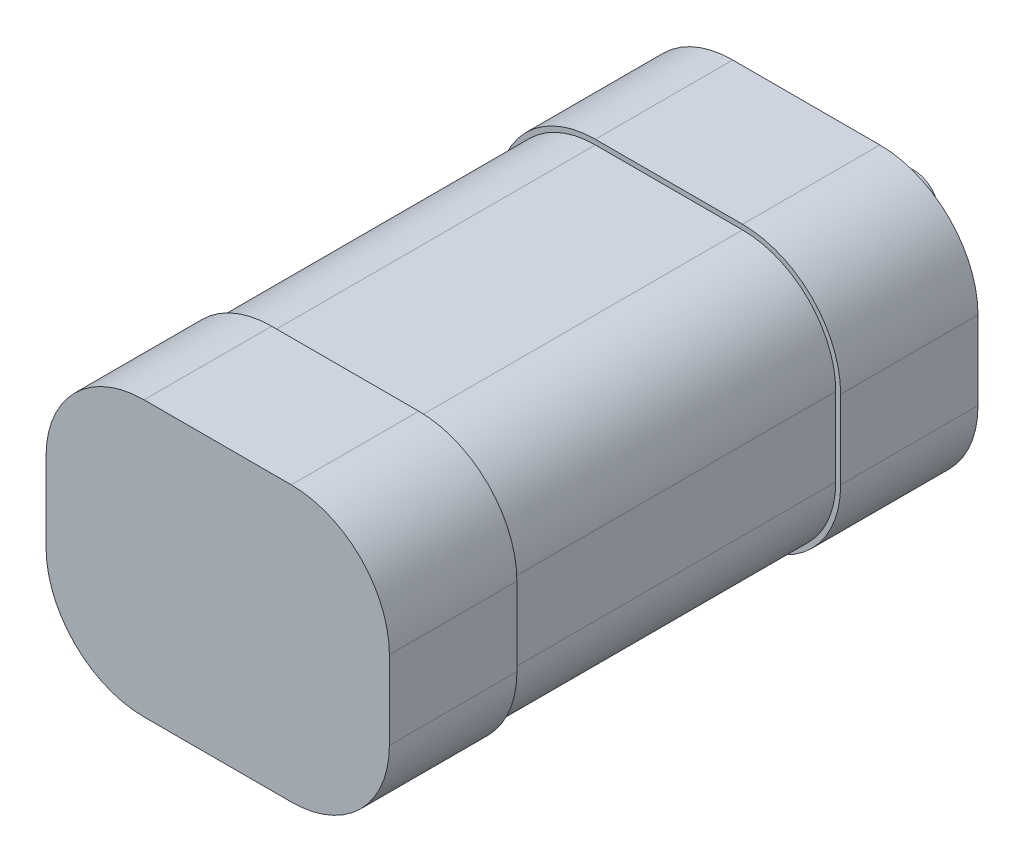
ISO-10303-21;
HEADER;
FILE_DESCRIPTION(('STEP AP214'),'2;1');
FILE_NAME('part.step','',(''),(''),'','','');
FILE_SCHEMA(('AUTOMOTIVE_DESIGN { 1 0 10303 214 1 1 1 1 }'));
ENDSEC;
DATA;
#1=APPLICATION_CONTEXT('core data for automotive mechanical design processes');
#2=APPLICATION_PROTOCOL_DEFINITION('international standard','automotive_design',2000,#1);
#3=PRODUCT_CONTEXT('',#1,'mechanical');
#4=PRODUCT('Part','Part','',(#3));
#5=PRODUCT_RELATED_PRODUCT_CATEGORY('part','',(#4));
#6=PRODUCT_DEFINITION_FORMATION('','',#4);
#7=PRODUCT_DEFINITION_CONTEXT('part definition',#1,'design');
#8=PRODUCT_DEFINITION('design','',#6,#7);
#9=PRODUCT_DEFINITION_SHAPE('','',#8);
#10=(LENGTH_UNIT() NAMED_UNIT(*) SI_UNIT(.MILLI.,.METRE.));
#11=(NAMED_UNIT(*) PLANE_ANGLE_UNIT() SI_UNIT($,.RADIAN.));
#12=(NAMED_UNIT(*) SI_UNIT($,.STERADIAN.) SOLID_ANGLE_UNIT());
#13=UNCERTAINTY_MEASURE_WITH_UNIT(LENGTH_MEASURE(1.E-05),#10,'distance_accuracy_value','');
#14=(GEOMETRIC_REPRESENTATION_CONTEXT(3) GLOBAL_UNCERTAINTY_ASSIGNED_CONTEXT((#13)) GLOBAL_UNIT_ASSIGNED_CONTEXT((#10,
#11,#12)) REPRESENTATION_CONTEXT('',''));
#15=CARTESIAN_POINT('',(0.,0.,0.));
#16=DIRECTION('',(0.,0.,1.));
#17=DIRECTION('',(1.,0.,0.));
#18=AXIS2_PLACEMENT_3D('',#15,#16,#17);
#19=CARTESIAN_POINT('',(-1.75,-1.4,-7.1));
#20=DIRECTION('',(0.,0.,1.));
#21=DIRECTION('',(1.,0.,0.));
#22=AXIS2_PLACEMENT_3D('',#19,#20,#21);
#23=PLANE('',#22);
#24=CARTESIAN_POINT('',(0.,0.,-7.1));
#25=DIRECTION('',(0.,0.,1.));
#26=DIRECTION('',(1.,0.,0.));
#27=AXIS2_PLACEMENT_3D('',#24,#25,#26);
#28=CIRCLE('',#27,0.25);
#29=CARTESIAN_POINT('',(0.25,0.,-7.1));
#30=VERTEX_POINT('',#29);
#31=EDGE_CURVE('E18',#30,#30,#28,.T.);
#32=ORIENTED_EDGE('',*,*,#31,.F.);
#33=EDGE_LOOP('',(#32));
#34=FACE_BOUND('',#33,.T.);
#35=ADVANCED_FACE('F15',(#34),#23,.F.);
#36=CARTESIAN_POINT('',(0.,0.,-14.9071067811865));
#37=DIRECTION('',(0.,0.,1.));
#38=DIRECTION('',(1.,0.,0.));
#39=AXIS2_PLACEMENT_3D('',#36,#37,#38);
#40=CYLINDRICAL_SURFACE('',#39,0.25);
#41=CARTESIAN_POINT('',(0.,0.,-6.5));
#42=DIRECTION('',(0.,0.,1.));
#43=DIRECTION('',(1.,0.,0.));
#44=AXIS2_PLACEMENT_3D('',#41,#42,#43);
#45=CIRCLE('',#44,0.25);
#46=CARTESIAN_POINT('',(0.25,0.,-6.5));
#47=VERTEX_POINT('',#46);
#48=EDGE_CURVE('E189',#47,#47,#45,.T.);
#49=ORIENTED_EDGE('',*,*,#48,.F.);
#50=EDGE_LOOP('',(#49));
#51=FACE_BOUND('',#50,.T.);
#52=ORIENTED_EDGE('',*,*,#31,.T.);
#53=EDGE_LOOP('',(#52));
#54=FACE_BOUND('',#53,.T.);
#55=ADVANCED_FACE('F380',(#51,#54),#40,.T.);
#56=CARTESIAN_POINT('',(-0.75,-0.4,-6.5));
#57=DIRECTION('',(0.,0.,-1.));
#58=DIRECTION('',(-1.,0.,0.));
#59=AXIS2_PLACEMENT_3D('',#56,#57,#58);
#60=PLANE('',#59);
#61=ORIENTED_EDGE('',*,*,#48,.T.);
#62=EDGE_LOOP('',(#61));
#63=FACE_BOUND('',#62,.T.);
#64=CARTESIAN_POINT('',(0.75,-0.4,-6.49999999997521));
#65=DIRECTION('',(0.,0.,1.));
#66=DIRECTION('',(0.,-1.,0.));
#67=AXIS2_PLACEMENT_3D('',#64,#65,#66);
#68=CIRCLE('',#67,0.133974596184998);
#69=CARTESIAN_POINT('',(0.75,-0.533974596237022,-6.49999999998761));
#70=VERTEX_POINT('',#69);
#71=CARTESIAN_POINT('',(0.883974596174903,-0.4,-6.50000000000602));
#72=VERTEX_POINT('',#71);
#73=EDGE_CURVE('E243',#70,#72,#68,.T.);
#74=ORIENTED_EDGE('',*,*,#73,.F.);
#75=DIRECTION('',(1.,0.,0.));
#76=VECTOR('',#75,1.);
#77=CARTESIAN_POINT('',(0.75,-0.533974596215556,-6.5));
#78=LINE('',#77,#76);
#79=CARTESIAN_POINT('',(-0.75,-0.533974596192591,-6.49999999999181));
#80=VERTEX_POINT('',#79);
#81=EDGE_CURVE('E187',#80,#70,#78,.T.);
#82=ORIENTED_EDGE('',*,*,#81,.F.);
#83=CARTESIAN_POINT('',(-0.75,-0.4,-6.49999999997521));
#84=DIRECTION('',(0.,0.,1.));
#85=DIRECTION('',(0.,-1.,0.));
#86=AXIS2_PLACEMENT_3D('',#83,#84,#85);
#87=CIRCLE('',#86,0.133974596206372);
#88=CARTESIAN_POINT('',(-0.883974596174903,-0.4,-6.50000000000602));
#89=VERTEX_POINT('',#88);
#90=EDGE_CURVE('E179',#80,#89,#87,.F.);
#91=ORIENTED_EDGE('',*,*,#90,.T.);
#92=DIRECTION('',(0.,1.,0.));
#93=VECTOR('',#92,1.);
#94=CARTESIAN_POINT('',(-0.883974596215556,-0.4,-6.5));
#95=LINE('',#94,#93);
#96=CARTESIAN_POINT('',(-0.883974596174903,0.4,-6.50000000000602));
#97=VERTEX_POINT('',#96);
#98=EDGE_CURVE('E184',#97,#89,#95,.F.);
#99=ORIENTED_EDGE('',*,*,#98,.F.);
#100=CARTESIAN_POINT('',(-0.75,0.4,-6.49999999997521));
#101=DIRECTION('',(0.,0.,1.));
#102=DIRECTION('',(0.,-1.,0.));
#103=AXIS2_PLACEMENT_3D('',#100,#101,#102);
#104=CIRCLE('',#103,0.133974596206372);
#105=CARTESIAN_POINT('',(-0.75,0.533974596237022,-6.49999999998761));
#106=VERTEX_POINT('',#105);
#107=EDGE_CURVE('E200',#106,#97,#104,.T.);
#108=ORIENTED_EDGE('',*,*,#107,.F.);
#109=DIRECTION('',(1.,0.,0.));
#110=VECTOR('',#109,1.);
#111=CARTESIAN_POINT('',(-0.75,0.533974596215555,-6.5));
#112=LINE('',#111,#110);
#113=CARTESIAN_POINT('',(0.75,0.533974596164169,-6.50000000000602));
#114=VERTEX_POINT('',#113);
#115=EDGE_CURVE('E273',#114,#106,#112,.F.);
#116=ORIENTED_EDGE('',*,*,#115,.F.);
#117=CARTESIAN_POINT('',(0.75,0.4,-6.49999999997521));
#118=DIRECTION('',(0.,0.,1.));
#119=DIRECTION('',(0.,-1.,0.));
#120=AXIS2_PLACEMENT_3D('',#117,#118,#119);
#121=CIRCLE('',#120,0.133974596184998);
#122=CARTESIAN_POINT('',(0.883974596237022,0.4,-6.49999999998761));
#123=VERTEX_POINT('',#122);
#124=EDGE_CURVE('E267',#123,#114,#121,.T.);
#125=ORIENTED_EDGE('',*,*,#124,.F.);
#126=DIRECTION('',(0.,1.,0.));
#127=VECTOR('',#126,1.);
#128=CARTESIAN_POINT('',(0.883974596215556,0.4,-6.5));
#129=LINE('',#128,#127);
#130=EDGE_CURVE('E249',#72,#123,#129,.T.);
#131=ORIENTED_EDGE('',*,*,#130,.F.);
#132=EDGE_LOOP('',(#74,#82,#91,#99,#108,#116,#125,#131));
#133=FACE_BOUND('',#132,.T.);
#134=ADVANCED_FACE('F183',(#63,#133),#60,.T.);
#135=CARTESIAN_POINT('',(0.75,-1.35,-13.5416586692185));
#136=DIRECTION('',(0.,1.,0.));
#137=DIRECTION('',(-1.,0.,0.));
#138=AXIS2_PLACEMENT_3D('',#135,#136,#137);
#139=PLANE('',#138);
#140=DIRECTION('',(-1.,0.,0.));
#141=VECTOR('',#140,1.);
#142=CARTESIAN_POINT('',(0.75,-1.35,-4.6));
#143=LINE('',#142,#141);
#144=CARTESIAN_POINT('',(0.75,-1.35,-4.6));
#145=VERTEX_POINT('',#144);
#146=CARTESIAN_POINT('',(-0.75,-1.35,-4.6));
#147=VERTEX_POINT('',#146);
#148=EDGE_CURVE('E293',#145,#147,#143,.T.);
#149=ORIENTED_EDGE('',*,*,#148,.F.);
#150=DIRECTION('',(0.,0.,1.));
#151=VECTOR('',#150,1.);
#152=CARTESIAN_POINT('',(0.75,-1.35,-13.5416586692185));
#153=LINE('',#152,#151);
#154=CARTESIAN_POINT('',(0.75,-1.35,-1.3));
#155=VERTEX_POINT('',#154);
#156=EDGE_CURVE('E211',#155,#145,#153,.F.);
#157=ORIENTED_EDGE('',*,*,#156,.F.);
#158=DIRECTION('',(-1.,0.,0.));
#159=VECTOR('',#158,1.);
#160=CARTESIAN_POINT('',(0.75,-1.35,-1.3));
#161=LINE('',#160,#159);
#162=CARTESIAN_POINT('',(-0.75,-1.35,-1.3));
#163=VERTEX_POINT('',#162);
#164=EDGE_CURVE('E291',#163,#155,#161,.F.);
#165=ORIENTED_EDGE('',*,*,#164,.F.);
#166=DIRECTION('',(0.,0.,1.));
#167=VECTOR('',#166,1.);
#168=CARTESIAN_POINT('',(-0.75,-1.35,-13.5416586692185));
#169=LINE('',#168,#167);
#170=EDGE_CURVE('E301',#147,#163,#169,.T.);
#171=ORIENTED_EDGE('',*,*,#170,.F.);
#172=EDGE_LOOP('',(#149,#157,#165,#171));
#173=FACE_BOUND('',#172,.T.);
#174=ADVANCED_FACE('F524',(#173),#139,.F.);
#175=CARTESIAN_POINT('',(-0.75,-0.4,-13.5416586692185));
#176=DIRECTION('',(0.,0.,1.));
#177=DIRECTION('',(1.,0.,0.));
#178=AXIS2_PLACEMENT_3D('',#175,#176,#177);
#179=CYLINDRICAL_SURFACE('',#178,0.95);
#180=ORIENTED_EDGE('',*,*,#170,.T.);
#181=CARTESIAN_POINT('',(-0.75,-0.4,-1.3));
#182=DIRECTION('',(0.,0.,1.));
#183=DIRECTION('',(1.,0.,0.));
#184=AXIS2_PLACEMENT_3D('',#181,#182,#183);
#185=CIRCLE('',#184,0.95);
#186=CARTESIAN_POINT('',(-1.7,-0.4,-1.3));
#187=VERTEX_POINT('',#186);
#188=EDGE_CURVE('E201',#163,#187,#185,.F.);
#189=ORIENTED_EDGE('',*,*,#188,.T.);
#190=DIRECTION('',(0.,0.,1.));
#191=VECTOR('',#190,1.);
#192=CARTESIAN_POINT('',(-1.7,-0.4,-13.5416586692185));
#193=LINE('',#192,#191);
#194=CARTESIAN_POINT('',(-1.7,-0.4,-4.6));
#195=VERTEX_POINT('',#194);
#196=EDGE_CURVE('E284',#187,#195,#193,.F.);
#197=ORIENTED_EDGE('',*,*,#196,.T.);
#198=CARTESIAN_POINT('',(-0.75,-0.4,-4.6));
#199=DIRECTION('',(0.,0.,1.));
#200=DIRECTION('',(1.,0.,0.));
#201=AXIS2_PLACEMENT_3D('',#198,#199,#200);
#202=CIRCLE('',#201,0.95);
#203=EDGE_CURVE('E295',#195,#147,#202,.T.);
#204=ORIENTED_EDGE('',*,*,#203,.T.);
#205=EDGE_LOOP('',(#180,#189,#197,#204));
#206=FACE_BOUND('',#205,.T.);
#207=ADVANCED_FACE('F521',(#206),#179,.T.);
#208=CARTESIAN_POINT('',(-1.75,-0.4,-6.));
#209=DIRECTION('',(-0.499999999999998,0.,-0.86602540378444));
#210=DIRECTION('',(-0.86602540378444,0.,0.499999999999998));
#211=AXIS2_PLACEMENT_3D('',#208,#209,#210);
#212=PLANE('',#211);
#213=ORIENTED_EDGE('',*,*,#98,.T.);
#214=DIRECTION('',(0.86602540378444,0.,-0.499999999999998));
#215=VECTOR('',#214,1.);
#216=CARTESIAN_POINT('',(-499000.,-0.4,288090.773962651));
#217=LINE('',#216,#215);
#218=CARTESIAN_POINT('',(-1.74999999994702,-0.4,-6.00000000002137));
#219=VERTEX_POINT('',#218);
#220=EDGE_CURVE('E195',#219,#89,#217,.T.);
#221=ORIENTED_EDGE('',*,*,#220,.F.);
#222=DIRECTION('',(0.,1.,0.));
#223=VECTOR('',#222,1.);
#224=CARTESIAN_POINT('',(-1.75,-0.4,-6.));
#225=LINE('',#224,#223);
#226=CARTESIAN_POINT('',(-1.74999999994702,0.4,-6.00000000002137));
#227=VERTEX_POINT('',#226);
#228=EDGE_CURVE('E220',#219,#227,#225,.T.);
#229=ORIENTED_EDGE('',*,*,#228,.T.);
#230=DIRECTION('',(0.86602540378444,0.,-0.499999999999998));
#231=VECTOR('',#230,1.);
#232=CARTESIAN_POINT('',(-499000.,0.4,288090.773962651));
#233=LINE('',#232,#231);
#234=EDGE_CURVE('E198',#97,#227,#233,.F.);
#235=ORIENTED_EDGE('',*,*,#234,.F.);
#236=EDGE_LOOP('',(#213,#221,#229,#235));
#237=FACE_BOUND('',#236,.T.);
#238=ADVANCED_FACE('F192',(#237),#212,.T.);
#239=CARTESIAN_POINT('',(-0.75,0.4,-6.00000000008549));
#240=DIRECTION('',(0.,0.,1.));
#241=DIRECTION('',(0.,-1.,0.));
#242=AXIS2_PLACEMENT_3D('',#239,#240,#241);
#243=CONICAL_SURFACE('',#242,0.999999999788088,1.04719755119074);
#244=ORIENTED_EDGE('',*,*,#107,.T.);
#245=ORIENTED_EDGE('',*,*,#234,.T.);
#246=CARTESIAN_POINT('',(-0.75,0.4,-6.));
#247=DIRECTION('',(0.,0.,1.));
#248=DIRECTION('',(1.,0.,0.));
#249=AXIS2_PLACEMENT_3D('',#246,#247,#248);
#250=CIRCLE('',#249,1.);
#251=CARTESIAN_POINT('',(-0.75,1.4,-6.));
#252=VERTEX_POINT('',#251);
#253=EDGE_CURVE('E222',#252,#227,#250,.T.);
#254=ORIENTED_EDGE('',*,*,#253,.F.);
#255=DIRECTION('',(0.,0.86602540378444,0.499999999999998));
#256=VECTOR('',#255,1.);
#257=CARTESIAN_POINT('',(-0.75,1.4,-6.));
#258=LINE('',#257,#256);
#259=EDGE_CURVE('E270',#106,#252,#258,.T.);
#260=ORIENTED_EDGE('',*,*,#259,.F.);
#261=EDGE_LOOP('',(#244,#245,#254,#260));
#262=FACE_BOUND('',#261,.T.);
#263=ADVANCED_FACE('F514',(#262),#243,.T.);
#264=CARTESIAN_POINT('',(-0.75,1.4,-6.));
#265=DIRECTION('',(0.,0.499999999999998,-0.86602540378444));
#266=DIRECTION('',(0.,0.86602540378444,0.499999999999998));
#267=AXIS2_PLACEMENT_3D('',#264,#265,#266);
#268=PLANE('',#267);
#269=ORIENTED_EDGE('',*,*,#115,.T.);
#270=ORIENTED_EDGE('',*,*,#259,.T.);
#271=DIRECTION('',(1.,0.,0.));
#272=VECTOR('',#271,1.);
#273=CARTESIAN_POINT('',(-0.75,1.4,-6.));
#274=LINE('',#273,#272);
#275=CARTESIAN_POINT('',(0.75,1.39999999994056,-6.00000000002137));
#276=VERTEX_POINT('',#275);
#277=EDGE_CURVE('E256',#252,#276,#274,.T.);
#278=ORIENTED_EDGE('',*,*,#277,.T.);
#279=DIRECTION('',(0.,-0.86602540378444,-0.499999999999998));
#280=VECTOR('',#279,1.);
#281=CARTESIAN_POINT('',(0.750000000091665,499001.15,288091.639988055));
#282=LINE('',#281,#280);
#283=EDGE_CURVE('E264',#114,#276,#282,.F.);
#284=ORIENTED_EDGE('',*,*,#283,.F.);
#285=EDGE_LOOP('',(#269,#270,#278,#284));
#286=FACE_BOUND('',#285,.T.);
#287=ADVANCED_FACE('F510',(#286),#268,.T.);
#288=CARTESIAN_POINT('',(0.75,0.4,-6.00000000008549));
#289=DIRECTION('',(0.,0.,1.));
#290=DIRECTION('',(0.,-1.,0.));
#291=AXIS2_PLACEMENT_3D('',#288,#289,#290);
#292=CONICAL_SURFACE('',#291,0.999999999766714,1.04719755119074);
#293=ORIENTED_EDGE('',*,*,#124,.T.);
#294=ORIENTED_EDGE('',*,*,#283,.T.);
#295=CARTESIAN_POINT('',(0.75,0.4,-6.));
#296=DIRECTION('',(0.,0.,1.));
#297=DIRECTION('',(1.,0.,0.));
#298=AXIS2_PLACEMENT_3D('',#295,#296,#297);
#299=CIRCLE('',#298,1.);
#300=CARTESIAN_POINT('',(1.75,0.4,-6.));
#301=VERTEX_POINT('',#300);
#302=EDGE_CURVE('E252',#301,#276,#299,.T.);
#303=ORIENTED_EDGE('',*,*,#302,.F.);
#304=DIRECTION('',(-0.86602540378444,0.,-0.499999999999998));
#305=VECTOR('',#304,1.);
#306=CARTESIAN_POINT('',(1.75,0.4,-6.));
#307=LINE('',#306,#305);
#308=EDGE_CURVE('E246',#123,#301,#307,.F.);
#309=ORIENTED_EDGE('',*,*,#308,.F.);
#310=EDGE_LOOP('',(#293,#294,#303,#309));
#311=FACE_BOUND('',#310,.T.);
#312=ADVANCED_FACE('F506',(#311),#292,.T.);
#313=CARTESIAN_POINT('',(1.75,0.4,-6.));
#314=DIRECTION('',(0.499999999999998,0.,-0.86602540378444));
#315=DIRECTION('',(-0.86602540378444,0.,-0.499999999999998));
#316=AXIS2_PLACEMENT_3D('',#313,#314,#315);
#317=PLANE('',#316);
#318=ORIENTED_EDGE('',*,*,#130,.T.);
#319=ORIENTED_EDGE('',*,*,#308,.T.);
#320=DIRECTION('',(0.,1.,0.));
#321=VECTOR('',#320,1.);
#322=CARTESIAN_POINT('',(1.75,0.4,-6.));
#323=LINE('',#322,#321);
#324=CARTESIAN_POINT('',(1.74999999994702,-0.4,-6.00000000002137));
#325=VERTEX_POINT('',#324);
#326=EDGE_CURVE('E232',#301,#325,#323,.F.);
#327=ORIENTED_EDGE('',*,*,#326,.T.);
#328=DIRECTION('',(-0.86602540378444,0.,-0.499999999999998));
#329=VECTOR('',#328,1.);
#330=CARTESIAN_POINT('',(499001.5,-0.40000000006111,288091.639988055));
#331=LINE('',#330,#329);
#332=EDGE_CURVE('E240',#72,#325,#331,.F.);
#333=ORIENTED_EDGE('',*,*,#332,.F.);
#334=EDGE_LOOP('',(#318,#319,#327,#333));
#335=FACE_BOUND('',#334,.T.);
#336=ADVANCED_FACE('F502',(#335),#317,.T.);
#337=CARTESIAN_POINT('',(0.75,-0.4,-6.00000000008549));
#338=DIRECTION('',(0.,0.,1.));
#339=DIRECTION('',(0.,-1.,0.));
#340=AXIS2_PLACEMENT_3D('',#337,#338,#339);
#341=CONICAL_SURFACE('',#340,0.999999999766715,1.04719755119074);
#342=ORIENTED_EDGE('',*,*,#73,.T.);
#343=ORIENTED_EDGE('',*,*,#332,.T.);
#344=CARTESIAN_POINT('',(0.75,-0.4,-6.));
#345=DIRECTION('',(0.,0.,1.));
#346=DIRECTION('',(1.,0.,0.));
#347=AXIS2_PLACEMENT_3D('',#344,#345,#346);
#348=CIRCLE('',#347,1.);
#349=CARTESIAN_POINT('',(0.75,-1.4,-6.));
#350=VERTEX_POINT('',#349);
#351=EDGE_CURVE('E228',#350,#325,#348,.T.);
#352=ORIENTED_EDGE('',*,*,#351,.F.);
#353=DIRECTION('',(0.,0.86602540378444,-0.499999999999998));
#354=VECTOR('',#353,1.);
#355=CARTESIAN_POINT('',(0.75,-1.4,-6.));
#356=LINE('',#355,#354);
#357=EDGE_CURVE('E209',#70,#350,#356,.F.);
#358=ORIENTED_EDGE('',*,*,#357,.F.);
#359=EDGE_LOOP('',(#342,#343,#352,#358));
#360=FACE_BOUND('',#359,.T.);
#361=ADVANCED_FACE('F498',(#360),#341,.T.);
#362=CARTESIAN_POINT('',(0.75,-1.4,-6.));
#363=DIRECTION('',(0.,-0.499999999999998,-0.86602540378444));
#364=DIRECTION('',(0.,0.86602540378444,-0.499999999999998));
#365=AXIS2_PLACEMENT_3D('',#362,#363,#364);
#366=PLANE('',#365);
#367=ORIENTED_EDGE('',*,*,#81,.T.);
#368=ORIENTED_EDGE('',*,*,#357,.T.);
#369=DIRECTION('',(1.,0.,0.));
#370=VECTOR('',#369,1.);
#371=CARTESIAN_POINT('',(0.75,-1.4,-6.));
#372=LINE('',#371,#370);
#373=CARTESIAN_POINT('',(-0.75,-1.39999999994056,-6.00000000002137));
#374=VERTEX_POINT('',#373);
#375=EDGE_CURVE('E922',#350,#374,#372,.F.);
#376=ORIENTED_EDGE('',*,*,#375,.T.);
#377=DIRECTION('',(0.,0.86602540378444,-0.499999999999998));
#378=VECTOR('',#377,1.);
#379=CARTESIAN_POINT('',(-0.750000000030555,-498999.65,288090.773962651));
#380=LINE('',#379,#378);
#381=EDGE_CURVE('E208',#80,#374,#380,.F.);
#382=ORIENTED_EDGE('',*,*,#381,.F.);
#383=EDGE_LOOP('',(#367,#368,#376,#382));
#384=FACE_BOUND('',#383,.T.);
#385=ADVANCED_FACE('F495',(#384),#366,.T.);
#386=CARTESIAN_POINT('',(-0.75,-0.4,-6.00000000008549));
#387=DIRECTION('',(0.,0.,1.));
#388=DIRECTION('',(0.,-1.,0.));
#389=AXIS2_PLACEMENT_3D('',#386,#387,#388);
#390=CONICAL_SURFACE('',#389,0.999999999788088,1.04719755119074);
#391=ORIENTED_EDGE('',*,*,#90,.F.);
#392=ORIENTED_EDGE('',*,*,#381,.T.);
#393=CARTESIAN_POINT('',(-0.75,-0.4,-6.));
#394=DIRECTION('',(0.,0.,1.));
#395=DIRECTION('',(1.,0.,0.));
#396=AXIS2_PLACEMENT_3D('',#393,#394,#395);
#397=CIRCLE('',#396,1.);
#398=EDGE_CURVE('E206',#219,#374,#397,.T.);
#399=ORIENTED_EDGE('',*,*,#398,.F.);
#400=ORIENTED_EDGE('',*,*,#220,.T.);
#401=EDGE_LOOP('',(#391,#392,#399,#400));
#402=FACE_BOUND('',#401,.T.);
#403=ADVANCED_FACE('F204',(#402),#390,.T.);
#404=CARTESIAN_POINT('',(0.75,-0.4,-13.5416586692185));
#405=DIRECTION('',(0.,0.,1.));
#406=DIRECTION('',(1.,0.,0.));
#407=AXIS2_PLACEMENT_3D('',#404,#405,#406);
#408=CYLINDRICAL_SURFACE('',#407,0.95);
#409=DIRECTION('',(0.,0.,1.));
#410=VECTOR('',#409,1.);
#411=CARTESIAN_POINT('',(1.7,-0.399999999999999,-13.5416586692185));
#412=LINE('',#411,#410);
#413=CARTESIAN_POINT('',(1.7,-0.4,-4.6));
#414=VERTEX_POINT('',#413);
#415=CARTESIAN_POINT('',(1.7,-0.4,-1.3));
#416=VERTEX_POINT('',#415);
#417=EDGE_CURVE('E878',#414,#416,#412,.T.);
#418=ORIENTED_EDGE('',*,*,#417,.T.);
#419=CARTESIAN_POINT('',(0.75,-0.4,-1.3));
#420=DIRECTION('',(0.,0.,1.));
#421=DIRECTION('',(1.,0.,0.));
#422=AXIS2_PLACEMENT_3D('',#419,#420,#421);
#423=CIRCLE('',#422,0.95);
#424=EDGE_CURVE('E363',#416,#155,#423,.F.);
#425=ORIENTED_EDGE('',*,*,#424,.T.);
#426=ORIENTED_EDGE('',*,*,#156,.T.);
#427=CARTESIAN_POINT('',(0.75,-0.4,-4.6));
#428=DIRECTION('',(0.,0.,1.));
#429=DIRECTION('',(1.,0.,0.));
#430=AXIS2_PLACEMENT_3D('',#427,#428,#429);
#431=CIRCLE('',#430,0.95);
#432=EDGE_CURVE('E290',#145,#414,#431,.T.);
#433=ORIENTED_EDGE('',*,*,#432,.T.);
#434=EDGE_LOOP('',(#418,#425,#426,#433));
#435=FACE_BOUND('',#434,.T.);
#436=ADVANCED_FACE('F488',(#435),#408,.T.);
#437=CARTESIAN_POINT('',(-1.7,-0.4,-13.5416586692185));
#438=DIRECTION('',(1.,0.,0.));
#439=DIRECTION('',(0.,1.,0.));
#440=AXIS2_PLACEMENT_3D('',#437,#438,#439);
#441=PLANE('',#440);
#442=DIRECTION('',(0.,1.,0.));
#443=VECTOR('',#442,1.);
#444=CARTESIAN_POINT('',(-1.7,-0.4,-4.6));
#445=LINE('',#444,#443);
#446=CARTESIAN_POINT('',(-1.7,0.4,-4.6));
#447=VERTEX_POINT('',#446);
#448=EDGE_CURVE('E223',#195,#447,#445,.T.);
#449=ORIENTED_EDGE('',*,*,#448,.F.);
#450=ORIENTED_EDGE('',*,*,#196,.F.);
#451=DIRECTION('',(0.,1.,0.));
#452=VECTOR('',#451,1.);
#453=CARTESIAN_POINT('',(-1.7,-0.4,-1.3));
#454=LINE('',#453,#452);
#455=CARTESIAN_POINT('',(-1.7,0.4,-1.3));
#456=VERTEX_POINT('',#455);
#457=EDGE_CURVE('E287',#456,#187,#454,.F.);
#458=ORIENTED_EDGE('',*,*,#457,.F.);
#459=DIRECTION('',(0.,0.,1.));
#460=VECTOR('',#459,1.);
#461=CARTESIAN_POINT('',(-1.7,0.4,-13.5416586692185));
#462=LINE('',#461,#460);
#463=EDGE_CURVE('E362',#447,#456,#462,.T.);
#464=ORIENTED_EDGE('',*,*,#463,.F.);
#465=EDGE_LOOP('',(#449,#450,#458,#464));
#466=FACE_BOUND('',#465,.T.);
#467=ADVANCED_FACE('F484',(#466),#441,.F.);
#468=CARTESIAN_POINT('',(-1.75,-0.4,-16.482186966203));
#469=DIRECTION('',(1.,0.,0.));
#470=DIRECTION('',(0.,0.,-1.));
#471=AXIS2_PLACEMENT_3D('',#468,#469,#470);
#472=PLANE('',#471);
#473=ORIENTED_EDGE('',*,*,#228,.F.);
#474=DIRECTION('',(0.,0.,1.));
#475=VECTOR('',#474,1.);
#476=CARTESIAN_POINT('',(-1.75,-0.4,-16.482186966203));
#477=LINE('',#476,#475);
#478=CARTESIAN_POINT('',(-1.75,-0.4,-4.6));
#479=VERTEX_POINT('',#478);
#480=EDGE_CURVE('E920',#479,#219,#477,.F.);
#481=ORIENTED_EDGE('',*,*,#480,.F.);
#482=DIRECTION('',(0.,1.,0.));
#483=VECTOR('',#482,1.);
#484=CARTESIAN_POINT('',(-1.75,-0.4,-4.6));
#485=LINE('',#484,#483);
#486=CARTESIAN_POINT('',(-1.75,0.4,-4.6));
#487=VERTEX_POINT('',#486);
#488=EDGE_CURVE('E359',#479,#487,#485,.T.);
#489=ORIENTED_EDGE('',*,*,#488,.T.);
#490=DIRECTION('',(0.,0.,1.));
#491=VECTOR('',#490,1.);
#492=CARTESIAN_POINT('',(-1.75,0.4,-16.482186966203));
#493=LINE('',#492,#491);
#494=EDGE_CURVE('E278',#227,#487,#493,.T.);
#495=ORIENTED_EDGE('',*,*,#494,.F.);
#496=EDGE_LOOP('',(#473,#481,#489,#495));
#497=FACE_BOUND('',#496,.T.);
#498=ADVANCED_FACE('F480',(#497),#472,.F.);
#499=CARTESIAN_POINT('',(-0.75,0.4,-16.482186966203));
#500=DIRECTION('',(0.,0.,1.));
#501=DIRECTION('',(1.,0.,0.));
#502=AXIS2_PLACEMENT_3D('',#499,#500,#501);
#503=CYLINDRICAL_SURFACE('',#502,1.);
#504=ORIENTED_EDGE('',*,*,#494,.T.);
#505=CARTESIAN_POINT('',(-0.75,0.4,-4.6));
#506=DIRECTION('',(0.,0.,1.));
#507=DIRECTION('',(1.,0.,0.));
#508=AXIS2_PLACEMENT_3D('',#505,#506,#507);
#509=CIRCLE('',#508,1.);
#510=CARTESIAN_POINT('',(-0.75,1.4,-4.6));
#511=VERTEX_POINT('',#510);
#512=EDGE_CURVE('E357',#487,#511,#509,.F.);
#513=ORIENTED_EDGE('',*,*,#512,.T.);
#514=DIRECTION('',(0.,0.,-1.));
#515=VECTOR('',#514,1.);
#516=CARTESIAN_POINT('',(-0.75,1.4,-16.482186966203));
#517=LINE('',#516,#515);
#518=EDGE_CURVE('E261',#511,#252,#517,.T.);
#519=ORIENTED_EDGE('',*,*,#518,.T.);
#520=ORIENTED_EDGE('',*,*,#253,.T.);
#521=EDGE_LOOP('',(#504,#513,#519,#520));
#522=FACE_BOUND('',#521,.T.);
#523=ADVANCED_FACE('F476',(#522),#503,.T.);
#524=CARTESIAN_POINT('',(-0.75,1.4,-16.482186966203));
#525=DIRECTION('',(0.,-1.,0.));
#526=DIRECTION('',(0.,0.,-1.));
#527=AXIS2_PLACEMENT_3D('',#524,#525,#526);
#528=PLANE('',#527);
#529=ORIENTED_EDGE('',*,*,#277,.F.);
#530=ORIENTED_EDGE('',*,*,#518,.F.);
#531=DIRECTION('',(-1.,0.,0.));
#532=VECTOR('',#531,1.);
#533=CARTESIAN_POINT('',(-0.75,1.4,-4.6));
#534=LINE('',#533,#532);
#535=CARTESIAN_POINT('',(0.75,1.4,-4.6));
#536=VERTEX_POINT('',#535);
#537=EDGE_CURVE('E356',#511,#536,#534,.F.);
#538=ORIENTED_EDGE('',*,*,#537,.T.);
#539=DIRECTION('',(0.,0.,1.));
#540=VECTOR('',#539,1.);
#541=CARTESIAN_POINT('',(0.75,1.4,-16.482186966203));
#542=LINE('',#541,#540);
#543=EDGE_CURVE('E255',#276,#536,#542,.T.);
#544=ORIENTED_EDGE('',*,*,#543,.F.);
#545=EDGE_LOOP('',(#529,#530,#538,#544));
#546=FACE_BOUND('',#545,.T.);
#547=ADVANCED_FACE('F472',(#546),#528,.F.);
#548=CARTESIAN_POINT('',(0.75,0.4,-16.482186966203));
#549=DIRECTION('',(0.,0.,1.));
#550=DIRECTION('',(1.,0.,0.));
#551=AXIS2_PLACEMENT_3D('',#548,#549,#550);
#552=CYLINDRICAL_SURFACE('',#551,1.);
#553=ORIENTED_EDGE('',*,*,#543,.T.);
#554=CARTESIAN_POINT('',(0.75,0.4,-4.6));
#555=DIRECTION('',(0.,0.,1.));
#556=DIRECTION('',(1.,0.,0.));
#557=AXIS2_PLACEMENT_3D('',#554,#555,#556);
#558=CIRCLE('',#557,1.);
#559=CARTESIAN_POINT('',(1.75,0.4,-4.6));
#560=VERTEX_POINT('',#559);
#561=EDGE_CURVE('E354',#536,#560,#558,.F.);
#562=ORIENTED_EDGE('',*,*,#561,.T.);
#563=DIRECTION('',(0.,0.,1.));
#564=VECTOR('',#563,1.);
#565=CARTESIAN_POINT('',(1.75,0.4,-16.482186966203));
#566=LINE('',#565,#564);
#567=EDGE_CURVE('E237',#560,#301,#566,.F.);
#568=ORIENTED_EDGE('',*,*,#567,.T.);
#569=ORIENTED_EDGE('',*,*,#302,.T.);
#570=EDGE_LOOP('',(#553,#562,#568,#569));
#571=FACE_BOUND('',#570,.T.);
#572=ADVANCED_FACE('F468',(#571),#552,.T.);
#573=CARTESIAN_POINT('',(1.75,0.4,-16.482186966203));
#574=DIRECTION('',(-1.,0.,0.));
#575=DIRECTION('',(0.,0.,1.));
#576=AXIS2_PLACEMENT_3D('',#573,#574,#575);
#577=PLANE('',#576);
#578=ORIENTED_EDGE('',*,*,#326,.F.);
#579=ORIENTED_EDGE('',*,*,#567,.F.);
#580=DIRECTION('',(0.,1.,0.));
#581=VECTOR('',#580,1.);
#582=CARTESIAN_POINT('',(1.75,-0.4,-4.6));
#583=LINE('',#582,#581);
#584=CARTESIAN_POINT('',(1.75,-0.4,-4.6));
#585=VERTEX_POINT('',#584);
#586=EDGE_CURVE('E353',#560,#585,#583,.F.);
#587=ORIENTED_EDGE('',*,*,#586,.T.);
#588=DIRECTION('',(0.,0.,1.));
#589=VECTOR('',#588,1.);
#590=CARTESIAN_POINT('',(1.75,-0.4,-16.482186966203));
#591=LINE('',#590,#589);
#592=EDGE_CURVE('E231',#325,#585,#591,.T.);
#593=ORIENTED_EDGE('',*,*,#592,.F.);
#594=EDGE_LOOP('',(#578,#579,#587,#593));
#595=FACE_BOUND('',#594,.T.);
#596=ADVANCED_FACE('F464',(#595),#577,.F.);
#597=CARTESIAN_POINT('',(0.75,-0.4,-16.482186966203));
#598=DIRECTION('',(0.,0.,1.));
#599=DIRECTION('',(1.,0.,0.));
#600=AXIS2_PLACEMENT_3D('',#597,#598,#599);
#601=CYLINDRICAL_SURFACE('',#600,1.);
#602=ORIENTED_EDGE('',*,*,#592,.T.);
#603=CARTESIAN_POINT('',(0.75,-0.4,-4.6));
#604=DIRECTION('',(0.,0.,1.));
#605=DIRECTION('',(1.,0.,0.));
#606=AXIS2_PLACEMENT_3D('',#603,#604,#605);
#607=CIRCLE('',#606,1.);
#608=CARTESIAN_POINT('',(0.75,-1.4,-4.6));
#609=VERTEX_POINT('',#608);
#610=EDGE_CURVE('E351',#585,#609,#607,.F.);
#611=ORIENTED_EDGE('',*,*,#610,.T.);
#612=DIRECTION('',(0.,0.,1.));
#613=VECTOR('',#612,1.);
#614=CARTESIAN_POINT('',(0.75,-1.4,-16.482186966203));
#615=LINE('',#614,#613);
#616=EDGE_CURVE('E925',#609,#350,#615,.F.);
#617=ORIENTED_EDGE('',*,*,#616,.T.);
#618=ORIENTED_EDGE('',*,*,#351,.T.);
#619=EDGE_LOOP('',(#602,#611,#617,#618));
#620=FACE_BOUND('',#619,.T.);
#621=ADVANCED_FACE('F460',(#620),#601,.T.);
#622=CARTESIAN_POINT('',(0.75,-1.4,-16.482186966203));
#623=DIRECTION('',(0.,1.,0.));
#624=DIRECTION('',(0.,0.,1.));
#625=AXIS2_PLACEMENT_3D('',#622,#623,#624);
#626=PLANE('',#625);
#627=ORIENTED_EDGE('',*,*,#375,.F.);
#628=ORIENTED_EDGE('',*,*,#616,.F.);
#629=DIRECTION('',(-1.,0.,0.));
#630=VECTOR('',#629,1.);
#631=CARTESIAN_POINT('',(-0.75,-1.4,-4.6));
#632=LINE('',#631,#630);
#633=CARTESIAN_POINT('',(-0.75,-1.4,-4.6));
#634=VERTEX_POINT('',#633);
#635=EDGE_CURVE('E350',#609,#634,#632,.T.);
#636=ORIENTED_EDGE('',*,*,#635,.T.);
#637=DIRECTION('',(0.,0.,1.));
#638=VECTOR('',#637,1.);
#639=CARTESIAN_POINT('',(-0.75,-1.4,-16.482186966203));
#640=LINE('',#639,#638);
#641=EDGE_CURVE('E913',#374,#634,#640,.T.);
#642=ORIENTED_EDGE('',*,*,#641,.F.);
#643=EDGE_LOOP('',(#627,#628,#636,#642));
#644=FACE_BOUND('',#643,.T.);
#645=ADVANCED_FACE('F456',(#644),#626,.F.);
#646=CARTESIAN_POINT('',(-0.75,-0.4,-16.482186966203));
#647=DIRECTION('',(0.,0.,1.));
#648=DIRECTION('',(1.,0.,0.));
#649=AXIS2_PLACEMENT_3D('',#646,#647,#648);
#650=CYLINDRICAL_SURFACE('',#649,1.);
#651=ORIENTED_EDGE('',*,*,#641,.T.);
#652=CARTESIAN_POINT('',(-0.75,-0.4,-4.6));
#653=DIRECTION('',(0.,0.,1.));
#654=DIRECTION('',(1.,0.,0.));
#655=AXIS2_PLACEMENT_3D('',#652,#653,#654);
#656=CIRCLE('',#655,1.);
#657=EDGE_CURVE('E347',#634,#479,#656,.F.);
#658=ORIENTED_EDGE('',*,*,#657,.T.);
#659=ORIENTED_EDGE('',*,*,#480,.T.);
#660=ORIENTED_EDGE('',*,*,#398,.T.);
#661=EDGE_LOOP('',(#651,#658,#659,#660));
#662=FACE_BOUND('',#661,.T.);
#663=ADVANCED_FACE('F452',(#662),#650,.T.);
#664=CARTESIAN_POINT('',(1.7,0.4,-13.5416586692185));
#665=DIRECTION('',(-1.,0.,0.));
#666=DIRECTION('',(0.,0.,1.));
#667=AXIS2_PLACEMENT_3D('',#664,#665,#666);
#668=PLANE('',#667);
#669=DIRECTION('',(0.,1.,0.));
#670=VECTOR('',#669,1.);
#671=CARTESIAN_POINT('',(1.7,-0.4,-4.6));
#672=LINE('',#671,#670);
#673=CARTESIAN_POINT('',(1.7,0.4,-4.6));
#674=VERTEX_POINT('',#673);
#675=EDGE_CURVE('E346',#414,#674,#672,.T.);
#676=ORIENTED_EDGE('',*,*,#675,.T.);
#677=DIRECTION('',(0.,0.,1.));
#678=VECTOR('',#677,1.);
#679=CARTESIAN_POINT('',(1.7,0.4,-13.5416586692185));
#680=LINE('',#679,#678);
#681=CARTESIAN_POINT('',(1.7,0.4,-1.3));
#682=VERTEX_POINT('',#681);
#683=EDGE_CURVE('E342',#682,#674,#680,.F.);
#684=ORIENTED_EDGE('',*,*,#683,.F.);
#685=DIRECTION('',(0.,1.,0.));
#686=VECTOR('',#685,1.);
#687=CARTESIAN_POINT('',(1.7,0.4,-1.3));
#688=LINE('',#687,#686);
#689=EDGE_CURVE('E882',#416,#682,#688,.T.);
#690=ORIENTED_EDGE('',*,*,#689,.F.);
#691=ORIENTED_EDGE('',*,*,#417,.F.);
#692=EDGE_LOOP('',(#676,#684,#690,#691));
#693=FACE_BOUND('',#692,.T.);
#694=ADVANCED_FACE('F448',(#693),#668,.F.);
#695=CARTESIAN_POINT('',(-0.75,0.4,-13.5416586692185));
#696=DIRECTION('',(0.,0.,1.));
#697=DIRECTION('',(1.,0.,0.));
#698=AXIS2_PLACEMENT_3D('',#695,#696,#697);
#699=CYLINDRICAL_SURFACE('',#698,0.95);
#700=ORIENTED_EDGE('',*,*,#463,.T.);
#701=CARTESIAN_POINT('',(-0.75,0.4,-1.3));
#702=DIRECTION('',(0.,0.,1.));
#703=DIRECTION('',(1.,0.,0.));
#704=AXIS2_PLACEMENT_3D('',#701,#702,#703);
#705=CIRCLE('',#704,0.95);
#706=CARTESIAN_POINT('',(-0.75,1.35,-1.3));
#707=VERTEX_POINT('',#706);
#708=EDGE_CURVE('E360',#456,#707,#705,.F.);
#709=ORIENTED_EDGE('',*,*,#708,.T.);
#710=DIRECTION('',(0.,0.,1.));
#711=VECTOR('',#710,1.);
#712=CARTESIAN_POINT('',(-0.75,1.35,-13.5416586692185));
#713=LINE('',#712,#711);
#714=CARTESIAN_POINT('',(-0.75,1.35,-4.6));
#715=VERTEX_POINT('',#714);
#716=EDGE_CURVE('E338',#707,#715,#713,.F.);
#717=ORIENTED_EDGE('',*,*,#716,.T.);
#718=CARTESIAN_POINT('',(-0.75,0.4,-4.6));
#719=DIRECTION('',(0.,0.,1.));
#720=DIRECTION('',(1.,0.,0.));
#721=AXIS2_PLACEMENT_3D('',#718,#719,#720);
#722=CIRCLE('',#721,0.95);
#723=EDGE_CURVE('E343',#715,#447,#722,.T.);
#724=ORIENTED_EDGE('',*,*,#723,.T.);
#725=EDGE_LOOP('',(#700,#709,#717,#724));
#726=FACE_BOUND('',#725,.T.);
#727=ADVANCED_FACE('F444',(#726),#699,.T.);
#728=CARTESIAN_POINT('',(-0.75,-0.4,-4.6));
#729=DIRECTION('',(0.,0.,-1.));
#730=DIRECTION('',(-1.,0.,0.));
#731=AXIS2_PLACEMENT_3D('',#728,#729,#730);
#732=PLANE('',#731);
#733=DIRECTION('',(1.,0.,0.));
#734=VECTOR('',#733,1.);
#735=CARTESIAN_POINT('',(-0.75,1.35,-4.6));
#736=LINE('',#735,#734);
#737=CARTESIAN_POINT('',(0.75,1.35,-4.6));
#738=VERTEX_POINT('',#737);
#739=EDGE_CURVE('E896',#715,#738,#736,.T.);
#740=ORIENTED_EDGE('',*,*,#739,.T.);
#741=CARTESIAN_POINT('',(0.75,0.4,-4.6));
#742=DIRECTION('',(0.,0.,1.));
#743=DIRECTION('',(1.,0.,0.));
#744=AXIS2_PLACEMENT_3D('',#741,#742,#743);
#745=CIRCLE('',#744,0.95);
#746=EDGE_CURVE('E339',#674,#738,#745,.T.);
#747=ORIENTED_EDGE('',*,*,#746,.F.);
#748=ORIENTED_EDGE('',*,*,#675,.F.);
#749=ORIENTED_EDGE('',*,*,#432,.F.);
#750=ORIENTED_EDGE('',*,*,#148,.T.);
#751=ORIENTED_EDGE('',*,*,#203,.F.);
#752=ORIENTED_EDGE('',*,*,#448,.T.);
#753=ORIENTED_EDGE('',*,*,#723,.F.);
#754=EDGE_LOOP('',(#740,#747,#748,#749,#750,#751,#752,#753));
#755=FACE_BOUND('',#754,.T.);
#756=ORIENTED_EDGE('',*,*,#635,.F.);
#757=ORIENTED_EDGE('',*,*,#610,.F.);
#758=ORIENTED_EDGE('',*,*,#586,.F.);
#759=ORIENTED_EDGE('',*,*,#561,.F.);
#760=ORIENTED_EDGE('',*,*,#537,.F.);
#761=ORIENTED_EDGE('',*,*,#512,.F.);
#762=ORIENTED_EDGE('',*,*,#488,.F.);
#763=ORIENTED_EDGE('',*,*,#657,.F.);
#764=EDGE_LOOP('',(#756,#757,#758,#759,#760,#761,#762,#763));
#765=FACE_BOUND('',#764,.T.);
#766=ADVANCED_FACE('F440',(#755,#765),#732,.F.);
#767=CARTESIAN_POINT('',(0.75,0.4,-13.5416586692185));
#768=DIRECTION('',(0.,0.,1.));
#769=DIRECTION('',(1.,0.,0.));
#770=AXIS2_PLACEMENT_3D('',#767,#768,#769);
#771=CYLINDRICAL_SURFACE('',#770,0.95);
#772=DIRECTION('',(0.,0.,1.));
#773=VECTOR('',#772,1.);
#774=CARTESIAN_POINT('',(0.75,1.35,-13.5416586692185));
#775=LINE('',#774,#773);
#776=CARTESIAN_POINT('',(0.75,1.35,-1.3));
#777=VERTEX_POINT('',#776);
#778=EDGE_CURVE('E898',#738,#777,#775,.T.);
#779=ORIENTED_EDGE('',*,*,#778,.T.);
#780=CARTESIAN_POINT('',(0.75,0.4,-1.3));
#781=DIRECTION('',(0.,0.,1.));
#782=DIRECTION('',(1.,0.,0.));
#783=AXIS2_PLACEMENT_3D('',#780,#781,#782);
#784=CIRCLE('',#783,0.95);
#785=EDGE_CURVE('E335',#777,#682,#784,.F.);
#786=ORIENTED_EDGE('',*,*,#785,.T.);
#787=ORIENTED_EDGE('',*,*,#683,.T.);
#788=ORIENTED_EDGE('',*,*,#746,.T.);
#789=EDGE_LOOP('',(#779,#786,#787,#788));
#790=FACE_BOUND('',#789,.T.);
#791=ADVANCED_FACE('F436',(#790),#771,.T.);
#792=CARTESIAN_POINT('',(-0.75,1.35,-13.5416586692185));
#793=DIRECTION('',(0.,-1.,0.));
#794=DIRECTION('',(1.,0.,0.));
#795=AXIS2_PLACEMENT_3D('',#792,#793,#794);
#796=PLANE('',#795);
#797=ORIENTED_EDGE('',*,*,#739,.F.);
#798=ORIENTED_EDGE('',*,*,#716,.F.);
#799=DIRECTION('',(1.,0.,0.));
#800=VECTOR('',#799,1.);
#801=CARTESIAN_POINT('',(-1.75,1.35,-1.3));
#802=LINE('',#801,#800);
#803=EDGE_CURVE('E904',#707,#777,#802,.T.);
#804=ORIENTED_EDGE('',*,*,#803,.T.);
#805=ORIENTED_EDGE('',*,*,#778,.F.);
#806=EDGE_LOOP('',(#797,#798,#804,#805));
#807=FACE_BOUND('',#806,.T.);
#808=ADVANCED_FACE('F432',(#807),#796,.F.);
#809=CARTESIAN_POINT('',(-1.75,-1.4,-1.3));
#810=DIRECTION('',(0.,0.,1.));
#811=DIRECTION('',(1.,0.,0.));
#812=AXIS2_PLACEMENT_3D('',#809,#810,#811);
#813=PLANE('',#812);
#814=ORIENTED_EDGE('',*,*,#708,.F.);
#815=ORIENTED_EDGE('',*,*,#457,.T.);
#816=ORIENTED_EDGE('',*,*,#188,.F.);
#817=ORIENTED_EDGE('',*,*,#164,.T.);
#818=ORIENTED_EDGE('',*,*,#424,.F.);
#819=ORIENTED_EDGE('',*,*,#689,.T.);
#820=ORIENTED_EDGE('',*,*,#785,.F.);
#821=ORIENTED_EDGE('',*,*,#803,.F.);
#822=EDGE_LOOP('',(#814,#815,#816,#817,#818,#819,#820,#821));
#823=FACE_BOUND('',#822,.T.);
#824=CARTESIAN_POINT('',(0.75,-0.4,-1.3));
#825=DIRECTION('',(0.,0.,1.));
#826=DIRECTION('',(1.,0.,0.));
#827=AXIS2_PLACEMENT_3D('',#824,#825,#826);
#828=CIRCLE('',#827,1.);
#829=CARTESIAN_POINT('',(0.75,-1.4,-1.3));
#830=VERTEX_POINT('',#829);
#831=CARTESIAN_POINT('',(1.75,-0.4,-1.3));
#832=VERTEX_POINT('',#831);
#833=EDGE_CURVE('E331',#830,#832,#828,.T.);
#834=ORIENTED_EDGE('',*,*,#833,.F.);
#835=DIRECTION('',(1.,0.,0.));
#836=VECTOR('',#835,1.);
#837=CARTESIAN_POINT('',(-1.75,-1.4,-1.3));
#838=LINE('',#837,#836);
#839=CARTESIAN_POINT('',(-0.75,-1.4,-1.3));
#840=VERTEX_POINT('',#839);
#841=EDGE_CURVE('E334',#840,#830,#838,.T.);
#842=ORIENTED_EDGE('',*,*,#841,.F.);
#843=CARTESIAN_POINT('',(-0.75,-0.4,-1.3));
#844=DIRECTION('',(0.,0.,1.));
#845=DIRECTION('',(1.,0.,0.));
#846=AXIS2_PLACEMENT_3D('',#843,#844,#845);
#847=CIRCLE('',#846,1.);
#848=CARTESIAN_POINT('',(-1.75,-0.4,-1.3));
#849=VERTEX_POINT('',#848);
#850=EDGE_CURVE('E316',#849,#840,#847,.T.);
#851=ORIENTED_EDGE('',*,*,#850,.F.);
#852=DIRECTION('',(0.,-1.,0.));
#853=VECTOR('',#852,1.);
#854=CARTESIAN_POINT('',(-1.75,1.4,-1.3));
#855=LINE('',#854,#853);
#856=CARTESIAN_POINT('',(-1.75,0.4,-1.3));
#857=VERTEX_POINT('',#856);
#858=EDGE_CURVE('E1013',#857,#849,#855,.T.);
#859=ORIENTED_EDGE('',*,*,#858,.F.);
#860=CARTESIAN_POINT('',(-0.75,0.4,-1.3));
#861=DIRECTION('',(0.,0.,1.));
#862=DIRECTION('',(1.,0.,0.));
#863=AXIS2_PLACEMENT_3D('',#860,#861,#862);
#864=CIRCLE('',#863,1.);
#865=CARTESIAN_POINT('',(-0.75,1.4,-1.3));
#866=VERTEX_POINT('',#865);
#867=EDGE_CURVE('E321',#866,#857,#864,.T.);
#868=ORIENTED_EDGE('',*,*,#867,.F.);
#869=DIRECTION('',(-1.,0.,0.));
#870=VECTOR('',#869,1.);
#871=CARTESIAN_POINT('',(-1.75,1.4,-1.3));
#872=LINE('',#871,#870);
#873=CARTESIAN_POINT('',(0.75,1.4,-1.3));
#874=VERTEX_POINT('',#873);
#875=EDGE_CURVE('E999',#874,#866,#872,.T.);
#876=ORIENTED_EDGE('',*,*,#875,.F.);
#877=CARTESIAN_POINT('',(0.75,0.4,-1.3));
#878=DIRECTION('',(0.,0.,1.));
#879=DIRECTION('',(1.,0.,0.));
#880=AXIS2_PLACEMENT_3D('',#877,#878,#879);
#881=CIRCLE('',#880,1.);
#882=CARTESIAN_POINT('',(1.75,0.4,-1.3));
#883=VERTEX_POINT('',#882);
#884=EDGE_CURVE('E326',#883,#874,#881,.T.);
#885=ORIENTED_EDGE('',*,*,#884,.F.);
#886=DIRECTION('',(0.,1.,0.));
#887=VECTOR('',#886,1.);
#888=CARTESIAN_POINT('',(1.75,1.4,-1.3));
#889=LINE('',#888,#887);
#890=EDGE_CURVE('E330',#832,#883,#889,.T.);
#891=ORIENTED_EDGE('',*,*,#890,.F.);
#892=EDGE_LOOP('',(#834,#842,#851,#859,#868,#876,#885,#891));
#893=FACE_BOUND('',#892,.T.);
#894=ADVANCED_FACE('F428',(#823,#893),#813,.F.);
#895=CARTESIAN_POINT('',(-1.75,-1.4,-1.3));
#896=DIRECTION('',(0.,-1.,0.));
#897=DIRECTION('',(1.,0.,0.));
#898=AXIS2_PLACEMENT_3D('',#895,#896,#897);
#899=PLANE('',#898);
#900=DIRECTION('',(1.,0.,0.));
#901=VECTOR('',#900,1.);
#902=CARTESIAN_POINT('',(-1.75,-1.4,0.));
#903=LINE('',#902,#901);
#904=CARTESIAN_POINT('',(-0.75,-1.4,0.));
#905=VERTEX_POINT('',#904);
#906=CARTESIAN_POINT('',(0.75,-1.4,0.));
#907=VERTEX_POINT('',#906);
#908=EDGE_CURVE('E315',#905,#907,#903,.T.);
#909=ORIENTED_EDGE('',*,*,#908,.F.);
#910=DIRECTION('',(0.,0.,1.));
#911=VECTOR('',#910,1.);
#912=CARTESIAN_POINT('',(-0.75,-1.4,-1.3));
#913=LINE('',#912,#911);
#914=EDGE_CURVE('E319',#840,#905,#913,.T.);
#915=ORIENTED_EDGE('',*,*,#914,.F.);
#916=ORIENTED_EDGE('',*,*,#841,.T.);
#917=DIRECTION('',(0.,0.,1.));
#918=VECTOR('',#917,1.);
#919=CARTESIAN_POINT('',(0.75,-1.4,-1.3));
#920=LINE('',#919,#918);
#921=EDGE_CURVE('E333',#907,#830,#920,.F.);
#922=ORIENTED_EDGE('',*,*,#921,.F.);
#923=EDGE_LOOP('',(#909,#915,#916,#922));
#924=FACE_BOUND('',#923,.T.);
#925=ADVANCED_FACE('F424',(#924),#899,.T.);
#926=CARTESIAN_POINT('',(0.75,-0.4,-1.3));
#927=DIRECTION('',(0.,0.,1.));
#928=DIRECTION('',(1.,0.,0.));
#929=AXIS2_PLACEMENT_3D('',#926,#927,#928);
#930=CYLINDRICAL_SURFACE('',#929,1.);
#931=CARTESIAN_POINT('',(0.75,-0.4,0.));
#932=DIRECTION('',(0.,0.,1.));
#933=DIRECTION('',(1.,0.,0.));
#934=AXIS2_PLACEMENT_3D('',#931,#932,#933);
#935=CIRCLE('',#934,1.);
#936=CARTESIAN_POINT('',(1.75,-0.4,0.));
#937=VERTEX_POINT('',#936);
#938=EDGE_CURVE('E312',#907,#937,#935,.T.);
#939=ORIENTED_EDGE('',*,*,#938,.F.);
#940=ORIENTED_EDGE('',*,*,#921,.T.);
#941=ORIENTED_EDGE('',*,*,#833,.T.);
#942=DIRECTION('',(0.,0.,1.));
#943=VECTOR('',#942,1.);
#944=CARTESIAN_POINT('',(1.75,-0.4,-1.3));
#945=LINE('',#944,#943);
#946=EDGE_CURVE('E1009',#937,#832,#945,.F.);
#947=ORIENTED_EDGE('',*,*,#946,.F.);
#948=EDGE_LOOP('',(#939,#940,#941,#947));
#949=FACE_BOUND('',#948,.T.);
#950=ADVANCED_FACE('F420',(#949),#930,.T.);
#951=CARTESIAN_POINT('',(1.75,1.4,-1.3));
#952=DIRECTION('',(1.,0.,0.));
#953=DIRECTION('',(0.,1.,0.));
#954=AXIS2_PLACEMENT_3D('',#951,#952,#953);
#955=PLANE('',#954);
#956=ORIENTED_EDGE('',*,*,#890,.T.);
#957=DIRECTION('',(0.,0.,1.));
#958=VECTOR('',#957,1.);
#959=CARTESIAN_POINT('',(1.75,0.4,-1.3));
#960=LINE('',#959,#958);
#961=CARTESIAN_POINT('',(1.75,0.4,0.));
#962=VERTEX_POINT('',#961);
#963=EDGE_CURVE('E329',#962,#883,#960,.F.);
#964=ORIENTED_EDGE('',*,*,#963,.F.);
#965=DIRECTION('',(0.,1.,0.));
#966=VECTOR('',#965,1.);
#967=CARTESIAN_POINT('',(1.75,-1.4,0.));
#968=LINE('',#967,#966);
#969=EDGE_CURVE('E311',#937,#962,#968,.T.);
#970=ORIENTED_EDGE('',*,*,#969,.F.);
#971=ORIENTED_EDGE('',*,*,#946,.T.);
#972=EDGE_LOOP('',(#956,#964,#970,#971));
#973=FACE_BOUND('',#972,.T.);
#974=ADVANCED_FACE('F416',(#973),#955,.T.);
#975=CARTESIAN_POINT('',(0.75,0.4,-1.3));
#976=DIRECTION('',(0.,0.,1.));
#977=DIRECTION('',(1.,0.,0.));
#978=AXIS2_PLACEMENT_3D('',#975,#976,#977);
#979=CYLINDRICAL_SURFACE('',#978,1.);
#980=CARTESIAN_POINT('',(0.75,0.4,0.));
#981=DIRECTION('',(0.,0.,1.));
#982=DIRECTION('',(1.,0.,0.));
#983=AXIS2_PLACEMENT_3D('',#980,#981,#982);
#984=CIRCLE('',#983,1.);
#985=CARTESIAN_POINT('',(0.75,1.4,0.));
#986=VERTEX_POINT('',#985);
#987=EDGE_CURVE('E308',#962,#986,#984,.T.);
#988=ORIENTED_EDGE('',*,*,#987,.F.);
#989=ORIENTED_EDGE('',*,*,#963,.T.);
#990=ORIENTED_EDGE('',*,*,#884,.T.);
#991=DIRECTION('',(0.,0.,1.));
#992=VECTOR('',#991,1.);
#993=CARTESIAN_POINT('',(0.75,1.4,-1.3));
#994=LINE('',#993,#992);
#995=EDGE_CURVE('E325',#986,#874,#994,.F.);
#996=ORIENTED_EDGE('',*,*,#995,.F.);
#997=EDGE_LOOP('',(#988,#989,#990,#996));
#998=FACE_BOUND('',#997,.T.);
#999=ADVANCED_FACE('F412',(#998),#979,.T.);
#1000=CARTESIAN_POINT('',(-1.75,1.4,-1.3));
#1001=DIRECTION('',(0.,1.,0.));
#1002=DIRECTION('',(-1.,0.,0.));
#1003=AXIS2_PLACEMENT_3D('',#1000,#1001,#1002);
#1004=PLANE('',#1003);
#1005=DIRECTION('',(1.,0.,0.));
#1006=VECTOR('',#1005,1.);
#1007=CARTESIAN_POINT('',(-1.75,1.4,0.));
#1008=LINE('',#1007,#1006);
#1009=CARTESIAN_POINT('',(-0.75,1.4,0.));
#1010=VERTEX_POINT('',#1009);
#1011=EDGE_CURVE('E307',#986,#1010,#1008,.F.);
#1012=ORIENTED_EDGE('',*,*,#1011,.F.);
#1013=ORIENTED_EDGE('',*,*,#995,.T.);
#1014=ORIENTED_EDGE('',*,*,#875,.T.);
#1015=DIRECTION('',(0.,0.,1.));
#1016=VECTOR('',#1015,1.);
#1017=CARTESIAN_POINT('',(-0.75,1.4,-1.3));
#1018=LINE('',#1017,#1016);
#1019=EDGE_CURVE('E324',#1010,#866,#1018,.F.);
#1020=ORIENTED_EDGE('',*,*,#1019,.F.);
#1021=EDGE_LOOP('',(#1012,#1013,#1014,#1020));
#1022=FACE_BOUND('',#1021,.T.);
#1023=ADVANCED_FACE('F408',(#1022),#1004,.T.);
#1024=CARTESIAN_POINT('',(-0.75,0.4,-1.3));
#1025=DIRECTION('',(0.,0.,1.));
#1026=DIRECTION('',(1.,0.,0.));
#1027=AXIS2_PLACEMENT_3D('',#1024,#1025,#1026);
#1028=CYLINDRICAL_SURFACE('',#1027,1.);
#1029=CARTESIAN_POINT('',(-0.75,0.4,0.));
#1030=DIRECTION('',(0.,0.,1.));
#1031=DIRECTION('',(1.,0.,0.));
#1032=AXIS2_PLACEMENT_3D('',#1029,#1030,#1031);
#1033=CIRCLE('',#1032,1.);
#1034=CARTESIAN_POINT('',(-1.75,0.4,0.));
#1035=VERTEX_POINT('',#1034);
#1036=EDGE_CURVE('E304',#1010,#1035,#1033,.T.);
#1037=ORIENTED_EDGE('',*,*,#1036,.F.);
#1038=ORIENTED_EDGE('',*,*,#1019,.T.);
#1039=ORIENTED_EDGE('',*,*,#867,.T.);
#1040=DIRECTION('',(0.,0.,1.));
#1041=VECTOR('',#1040,1.);
#1042=CARTESIAN_POINT('',(-1.75,0.4,-1.3));
#1043=LINE('',#1042,#1041);
#1044=EDGE_CURVE('E320',#1035,#857,#1043,.F.);
#1045=ORIENTED_EDGE('',*,*,#1044,.F.);
#1046=EDGE_LOOP('',(#1037,#1038,#1039,#1045));
#1047=FACE_BOUND('',#1046,.T.);
#1048=ADVANCED_FACE('F405',(#1047),#1028,.T.);
#1049=CARTESIAN_POINT('',(-1.75,1.4,-1.3));
#1050=DIRECTION('',(-1.,0.,0.));
#1051=DIRECTION('',(0.,-1.,0.));
#1052=AXIS2_PLACEMENT_3D('',#1049,#1050,#1051);
#1053=PLANE('',#1052);
#1054=DIRECTION('',(0.,1.,0.));
#1055=VECTOR('',#1054,1.);
#1056=CARTESIAN_POINT('',(-1.75,-1.4,0.));
#1057=LINE('',#1056,#1055);
#1058=CARTESIAN_POINT('',(-1.75,-0.4,0.));
#1059=VERTEX_POINT('',#1058);
#1060=EDGE_CURVE('E24',#1035,#1059,#1057,.F.);
#1061=ORIENTED_EDGE('',*,*,#1060,.F.);
#1062=ORIENTED_EDGE('',*,*,#1044,.T.);
#1063=ORIENTED_EDGE('',*,*,#858,.T.);
#1064=DIRECTION('',(0.,0.,1.));
#1065=VECTOR('',#1064,1.);
#1066=CARTESIAN_POINT('',(-1.75,-0.4,-1.3));
#1067=LINE('',#1066,#1065);
#1068=EDGE_CURVE('E33',#1059,#849,#1067,.F.);
#1069=ORIENTED_EDGE('',*,*,#1068,.F.);
#1070=EDGE_LOOP('',(#1061,#1062,#1063,#1069));
#1071=FACE_BOUND('',#1070,.T.);
#1072=ADVANCED_FACE('F398',(#1071),#1053,.T.);
#1073=CARTESIAN_POINT('',(-0.75,-0.4,-1.3));
#1074=DIRECTION('',(0.,0.,1.));
#1075=DIRECTION('',(1.,0.,0.));
#1076=AXIS2_PLACEMENT_3D('',#1073,#1074,#1075);
#1077=CYLINDRICAL_SURFACE('',#1076,1.);
#1078=CARTESIAN_POINT('',(-0.75,-0.4,0.));
#1079=DIRECTION('',(0.,0.,1.));
#1080=DIRECTION('',(1.,0.,0.));
#1081=AXIS2_PLACEMENT_3D('',#1078,#1079,#1080);
#1082=CIRCLE('',#1081,1.);
#1083=EDGE_CURVE('E10',#1059,#905,#1082,.T.);
#1084=ORIENTED_EDGE('',*,*,#1083,.F.);
#1085=ORIENTED_EDGE('',*,*,#1068,.T.);
#1086=ORIENTED_EDGE('',*,*,#850,.T.);
#1087=ORIENTED_EDGE('',*,*,#914,.T.);
#1088=EDGE_LOOP('',(#1084,#1085,#1086,#1087));
#1089=FACE_BOUND('',#1088,.T.);
#1090=ADVANCED_FACE('F392',(#1089),#1077,.T.);
#1091=CARTESIAN_POINT('',(-1.75,-1.4,0.));
#1092=DIRECTION('',(0.,0.,1.));
#1093=DIRECTION('',(1.,0.,0.));
#1094=AXIS2_PLACEMENT_3D('',#1091,#1092,#1093);
#1095=PLANE('',#1094);
#1096=ORIENTED_EDGE('',*,*,#1060,.T.);
#1097=ORIENTED_EDGE('',*,*,#1083,.T.);
#1098=ORIENTED_EDGE('',*,*,#908,.T.);
#1099=ORIENTED_EDGE('',*,*,#938,.T.);
#1100=ORIENTED_EDGE('',*,*,#969,.T.);
#1101=ORIENTED_EDGE('',*,*,#987,.T.);
#1102=ORIENTED_EDGE('',*,*,#1011,.T.);
#1103=ORIENTED_EDGE('',*,*,#1036,.T.);
#1104=EDGE_LOOP('',(#1096,#1097,#1098,#1099,#1100,#1101,#1102,#1103));
#1105=FACE_BOUND('',#1104,.T.);
#1106=ADVANCED_FACE('F390',(#1105),#1095,.T.);
#1107=CLOSED_SHELL('',(#35,#55,#134,#174,#207,#238,#263,#287,#312,#336,#361,#385,#403,#436,#467,
#498,#523,#547,#572,#596,#621,#645,#663,#694,#727,#766,#791,#808,#894,#925,#950,#974,#999,#1023,
#1048,#1072,#1090,#1106));
#1108=MANIFOLD_SOLID_BREP('B1',#1107);
#1109=ADVANCED_BREP_SHAPE_REPRESENTATION('',(#18,#1108),#14);
#1110=SHAPE_DEFINITION_REPRESENTATION(#9,#1109);
ENDSEC;
END-ISO-10303-21;
